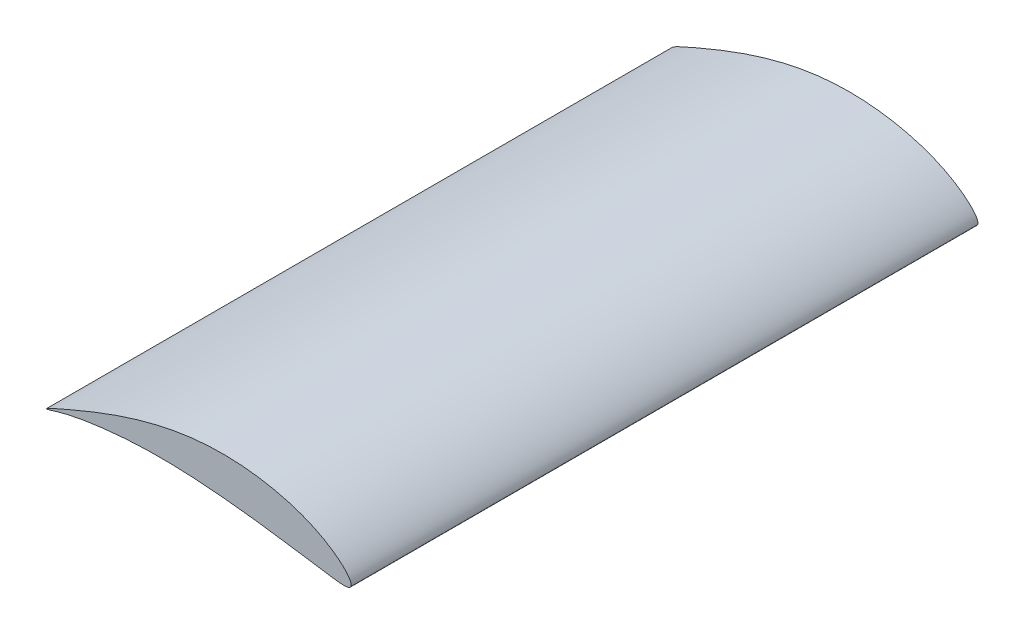
ISO-10303-21;
HEADER;
FILE_DESCRIPTION(('STEP AP214'),'2;1');
FILE_NAME('part.step','',(''),(''),'','','');
FILE_SCHEMA(('AUTOMOTIVE_DESIGN { 1 0 10303 214 1 1 1 1 }'));
ENDSEC;
DATA;
#1=APPLICATION_CONTEXT('core data for automotive mechanical design processes');
#2=APPLICATION_PROTOCOL_DEFINITION('international standard','automotive_design',2000,#1);
#3=PRODUCT_CONTEXT('',#1,'mechanical');
#4=PRODUCT('Part','Part','',(#3));
#5=PRODUCT_RELATED_PRODUCT_CATEGORY('part','',(#4));
#6=PRODUCT_DEFINITION_FORMATION('','',#4);
#7=PRODUCT_DEFINITION_CONTEXT('part definition',#1,'design');
#8=PRODUCT_DEFINITION('design','',#6,#7);
#9=PRODUCT_DEFINITION_SHAPE('','',#8);
#10=(LENGTH_UNIT() NAMED_UNIT(*) SI_UNIT(.MILLI.,.METRE.));
#11=(NAMED_UNIT(*) PLANE_ANGLE_UNIT() SI_UNIT($,.RADIAN.));
#12=(NAMED_UNIT(*) SI_UNIT($,.STERADIAN.) SOLID_ANGLE_UNIT());
#13=UNCERTAINTY_MEASURE_WITH_UNIT(LENGTH_MEASURE(1.E-05),#10,'distance_accuracy_value','');
#14=(GEOMETRIC_REPRESENTATION_CONTEXT(3) GLOBAL_UNCERTAINTY_ASSIGNED_CONTEXT((#13)) GLOBAL_UNIT_ASSIGNED_CONTEXT((#10,
#11,#12)) REPRESENTATION_CONTEXT('',''));
#15=CARTESIAN_POINT('',(0.,0.,0.));
#16=DIRECTION('',(0.,0.,1.));
#17=DIRECTION('',(1.,0.,0.));
#18=AXIS2_PLACEMENT_3D('',#15,#16,#17);
#19=CARTESIAN_POINT('',(-4.01569770567797,7.6413936640078,0.));
#20=DIRECTION('',(0.,0.,1.));
#21=DIRECTION('',(1.,0.,0.));
#22=AXIS2_PLACEMENT_3D('',#19,#20,#21);
#23=PLANE('',#22);
#24=CARTESIAN_POINT('',(-280.,0.014,0.));
#25=CARTESIAN_POINT('',(-279.771204707222,0.16829856286321,0.));
#26=CARTESIAN_POINT('',(-278.925281642335,0.738785444915881,0.));
#27=CARTESIAN_POINT('',(-277.112099035822,1.81145493001204,0.));
#28=CARTESIAN_POINT('',(-274.256791714638,3.26491157448409,0.));
#29=CARTESIAN_POINT('',(-270.467152625413,4.9472713282706,0.));
#30=CARTESIAN_POINT('',(-265.823521768113,7.00090594751356,0.));
#31=CARTESIAN_POINT('',(-260.30372490507,9.42028278027472,0.));
#32=CARTESIAN_POINT('',(-253.914026890152,12.132526753168,0.));
#33=CARTESIAN_POINT('',(-246.737129961845,15.1343419513262,0.));
#34=CARTESIAN_POINT('',(-238.843430318121,18.3591524786188,0.));
#35=CARTESIAN_POINT('',(-230.308105409819,21.7201635041301,0.));
#36=CARTESIAN_POINT('',(-221.209548368717,25.118644521127,0.));
#37=CARTESIAN_POINT('',(-211.633086788115,28.4758765124348,0.));
#38=CARTESIAN_POINT('',(-201.65733085926,31.7010514409087,0.));
#39=CARTESIAN_POINT('',(-191.372693180549,34.7397814525453,0.));
#40=CARTESIAN_POINT('',(-180.858920984524,37.5104983449512,0.));
#41=CARTESIAN_POINT('',(-170.196345420086,39.9452308087014,0.));
#42=CARTESIAN_POINT('',(-159.462988509903,41.9841439639911,0.));
#43=CARTESIAN_POINT('',(-148.709485722968,43.5780458592606,0.));
#44=CARTESIAN_POINT('',(-137.965500670848,44.7160423469702,0.));
#45=CARTESIAN_POINT('',(-127.257988986479,45.3688992655335,0.));
#46=CARTESIAN_POINT('',(-116.627978630922,45.5532963553043,0.));
#47=CARTESIAN_POINT('',(-106.135165372787,45.2525479001128,0.));
#48=CARTESIAN_POINT('',(-95.8312553124974,44.4969151433394,0.));
#49=CARTESIAN_POINT('',(-85.77263455369,43.3001663666237,0.));
#50=CARTESIAN_POINT('',(-76.0158477782512,41.6944021654237,0.));
#51=CARTESIAN_POINT('',(-66.6163245330872,39.711164621886,0.));
#52=CARTESIAN_POINT('',(-57.6315197591484,37.3706228779455,0.));
#53=CARTESIAN_POINT('',(-49.1130098143402,34.7105851682829,0.));
#54=CARTESIAN_POINT('',(-41.121037488414,31.7406709768156,0.));
#55=CARTESIAN_POINT('',(-33.7086167246629,28.5086261424112,0.));
#56=CARTESIAN_POINT('',(-26.9311950636037,25.0591382976576,0.));
#57=CARTESIAN_POINT('',(-20.8337324816237,21.4713810248683,0.));
#58=CARTESIAN_POINT('',(-15.4469769425425,17.85201901681,0.));
#59=CARTESIAN_POINT('',(-10.8005077639167,14.2855671608204,0.));
#60=CARTESIAN_POINT('',(-6.927579354582,10.8306846581378,0.));
#61=CARTESIAN_POINT('',(-3.84781649247876,7.56274984854721,0.));
#62=CARTESIAN_POINT('',(-1.6032425444141,4.57432221557344,0.));
#63=CARTESIAN_POINT('',(-0.316842726829754,2.08993164172271,0.));
#64=CARTESIAN_POINT('',(0.0955516083406207,0.147701002234351,0.));
#65=CARTESIAN_POINT('',(-0.190440036282485,-1.48008218093912,0.));
#66=CARTESIAN_POINT('',(-1.6181219099903,-2.81104592668113,0.));
#67=CARTESIAN_POINT('',(-3.98456270550732,-3.43021009401055,0.));
#68=CARTESIAN_POINT('',(-7.07396713922628,-3.62402271081694,0.));
#69=CARTESIAN_POINT('',(-10.9431991019674,-3.40377582967298,0.));
#70=CARTESIAN_POINT('',(-15.5713713547798,-2.86792500469395,0.));
#71=CARTESIAN_POINT('',(-20.9464422203592,-2.0962824107473,0.));
#72=CARTESIAN_POINT('',(-27.0380240353833,-1.18125327425882,0.));
#73=CARTESIAN_POINT('',(-33.8090901527232,-0.184623426700123,0.));
#74=CARTESIAN_POINT('',(-41.2077262986575,0.925009113586181,0.));
#75=CARTESIAN_POINT('',(-49.1870171143984,2.12163031281775,0.));
#76=CARTESIAN_POINT('',(-57.6897577132415,3.39105934404692,0.));
#77=CARTESIAN_POINT('',(-66.6635203954501,4.69526790087436,0.));
#78=CARTESIAN_POINT('',(-76.0515929731251,6.00864435022925,0.));
#79=CARTESIAN_POINT('',(-85.7985630976784,7.29838501496417,0.));
#80=CARTESIAN_POINT('',(-95.847404643839,8.53780484484674,0.));
#81=CARTESIAN_POINT('',(-106.140739911768,9.70566858617888,0.));
#82=CARTESIAN_POINT('',(-116.623055594311,10.7746415846232,0.));
#83=CARTESIAN_POINT('',(-127.242646452768,11.7253747610131,0.));
#84=CARTESIAN_POINT('',(-137.939971465741,12.5331503963465,0.));
#85=CARTESIAN_POINT('',(-148.67604442091,13.1728276796018,0.));
#86=CARTESIAN_POINT('',(-159.423043151761,13.6181343978469,0.));
#87=CARTESIAN_POINT('',(-170.153814535476,13.8510600518376,0.));
#88=CARTESIAN_POINT('',(-180.816971888348,13.8502166504001,0.));
#89=CARTESIAN_POINT('',(-191.33398763033,13.6110657668313,0.));
#90=CARTESIAN_POINT('',(-201.623483581562,13.1250966146957,0.));
#91=CARTESIAN_POINT('',(-211.601932997568,12.4309099898818,0.));
#92=CARTESIAN_POINT('',(-221.184797018405,11.5498191819582,0.));
#93=CARTESIAN_POINT('',(-230.291064502765,10.5253380054259,0.));
#94=CARTESIAN_POINT('',(-238.836766895428,9.36417282668983,0.));
#95=CARTESIAN_POINT('',(-246.740627761135,8.10017764530617,0.));
#96=CARTESIAN_POINT('',(-253.922603643824,6.76061862952087,0.));
#97=CARTESIAN_POINT('',(-260.310347725155,5.39867546775283,0.));
#98=CARTESIAN_POINT('',(-265.845478515148,4.05980298235575,0.));
#99=CARTESIAN_POINT('',(-270.478571586407,2.73074991744001,0.));
#100=CARTESIAN_POINT('',(-274.209001992196,1.52399427407298,0.));
#101=CARTESIAN_POINT('',(-277.055525725017,0.667762123567823,0.));
#102=CARTESIAN_POINT('',(-278.895533478517,0.20248248855209,0.));
#103=CARTESIAN_POINT('',(-279.77017857007,0.028829101559295,0.));
#104=CARTESIAN_POINT('',(-280.,-0.0168,0.));
#105=B_SPLINE_CURVE_WITH_KNOTS('',3,(#24,#25,#26,#27,#28,#29,#30,#31,#32,#33,#34,#35,#36,#37,
#38,#39,#40,#41,#42,#43,#44,#45,#46,#47,#48,#49,#50,#51,#52,#53,#54,#55,#56,#57,#58,#59,#60,#61,
#62,#63,#64,#65,#66,#67,#68,#69,#70,#71,#72,#73,#74,#75,#76,#77,#78,#79,#80,#81,#82,#83,#84,#85,
#86,#87,#88,#89,#90,#91,#92,#93,#94,#95,#96,#97,#98,#99,#100,#101,#102,#103,#104),.UNSPECIFIED.,
.F.,.F.,(4,1,1,1,1,1,1,1,1,1,1,1,1,1,1,1,1,1,1,1,1,1,1,1,1,1,1,1,1,1,1,1,1,1,1,1,1,1,1,1,1,1,1,
1,1,1,1,1,1,1,1,1,1,1,1,1,1,1,1,1,1,1,1,1,1,1,1,1,1,1,1,1,1,1,1,1,1,1,4),(0.,
0.00141347698915459,0.00522603753030976,0.0107810913857472,0.0178156081800761,0.026460950689211,
0.0367908885691698,0.0486855931526199,0.062017125033965,0.076639155258911,0.092362872446032,
0.109003461184226,0.12638690336568,0.144339125865098,0.162701027448999,0.181312718778214,
0.200023430663497,0.218712626381137,0.237261299204419,0.255692478420394,0.274037196641042,
0.292192582989639,0.310132767399931,0.327788162575705,0.345096618498639,0.36200193420608,
0.378421225753183,0.394286639421009,0.409543440211491,0.424114252666479,0.437937779894787,
0.450941832629922,0.463044023310106,0.474154416975767,0.484164574550778,0.493023961604412,
0.500713088022634,0.507125739322198,0.5121297054416,0.514904184931274,0.517171427264158,
0.520261618475645,0.524245300038304,0.529497960596986,0.536092184977371,0.544061140096641,
0.55336312730897,0.563904543129334,0.575614949415859,0.588420091890249,0.602226609671696,
0.616944447596993,0.632456508105352,0.648675826289431,0.66550111308048,0.682818193213687,
0.700538488106321,0.718564131538974,0.736789144730588,0.755151414762425,0.773513212407819,
0.791877575979801,0.81024492448745,0.828488568746422,0.846493195046706,0.864125178397901,
0.881248510345863,0.897725281664147,0.913415057961756,0.92818434584957,0.941897284560993,
0.954411455036345,0.965602701876979,0.975349727817201,0.983575521740871,0.99028457856453,
0.995432590285958,0.998799869064958,1.),.UNSPECIFIED.);
#106=CARTESIAN_POINT('',(-280.,0.014,0.));
#107=VERTEX_POINT('',#106);
#108=CARTESIAN_POINT('',(-280.,-0.0168,0.));
#109=VERTEX_POINT('',#108);
#110=EDGE_CURVE('E72',#107,#109,#105,.T.);
#111=ORIENTED_EDGE('',*,*,#110,.T.);
#112=DIRECTION('',(1.80231010491097E-12,-1.,0.));
#113=VECTOR('',#112,1.);
#114=CARTESIAN_POINT('',(-280.,0.014,0.));
#115=LINE('',#114,#113);
#116=EDGE_CURVE('E12',#107,#109,#115,.T.);
#117=ORIENTED_EDGE('',*,*,#116,.F.);
#118=EDGE_LOOP('',(#111,#117));
#119=FACE_BOUND('',#118,.T.);
#120=ADVANCED_FACE('F61',(#119),#23,.F.);
#121=CARTESIAN_POINT('',(-4.01569770567797,7.6413936640078,575.));
#122=DIRECTION('',(0.,0.,1.));
#123=DIRECTION('',(1.,0.,0.));
#124=AXIS2_PLACEMENT_3D('',#121,#122,#123);
#125=PLANE('',#124);
#126=CARTESIAN_POINT('',(-280.,-0.0168,575.));
#127=CARTESIAN_POINT('',(-279.77017857007,0.028829101559295,575.));
#128=CARTESIAN_POINT('',(-278.895533478517,0.20248248855209,575.));
#129=CARTESIAN_POINT('',(-277.055525725017,0.667762123567823,575.));
#130=CARTESIAN_POINT('',(-274.209001992196,1.52399427407298,575.));
#131=CARTESIAN_POINT('',(-270.478571586407,2.73074991744001,575.));
#132=CARTESIAN_POINT('',(-265.845478515148,4.05980298235575,575.));
#133=CARTESIAN_POINT('',(-260.310347725155,5.39867546775283,575.));
#134=CARTESIAN_POINT('',(-253.922603643824,6.76061862952087,575.));
#135=CARTESIAN_POINT('',(-246.740627761135,8.10017764530617,575.));
#136=CARTESIAN_POINT('',(-238.836766895428,9.36417282668983,575.));
#137=CARTESIAN_POINT('',(-230.291064502765,10.5253380054259,575.));
#138=CARTESIAN_POINT('',(-221.184797018405,11.5498191819582,575.));
#139=CARTESIAN_POINT('',(-211.601932997568,12.4309099898818,575.));
#140=CARTESIAN_POINT('',(-201.623483581562,13.1250966146957,575.));
#141=CARTESIAN_POINT('',(-191.33398763033,13.6110657668313,575.));
#142=CARTESIAN_POINT('',(-180.816971888348,13.8502166504001,575.));
#143=CARTESIAN_POINT('',(-170.153814535476,13.8510600518376,575.));
#144=CARTESIAN_POINT('',(-159.423043151761,13.6181343978469,575.));
#145=CARTESIAN_POINT('',(-148.67604442091,13.1728276796018,575.));
#146=CARTESIAN_POINT('',(-137.939971465741,12.5331503963465,575.));
#147=CARTESIAN_POINT('',(-127.242646452768,11.7253747610131,575.));
#148=CARTESIAN_POINT('',(-116.623055594311,10.7746415846232,575.));
#149=CARTESIAN_POINT('',(-106.140739911768,9.70566858617888,575.));
#150=CARTESIAN_POINT('',(-95.847404643839,8.53780484484674,575.));
#151=CARTESIAN_POINT('',(-85.7985630976784,7.29838501496417,575.));
#152=CARTESIAN_POINT('',(-76.0515929731251,6.00864435022925,575.));
#153=CARTESIAN_POINT('',(-66.6635203954501,4.69526790087436,575.));
#154=CARTESIAN_POINT('',(-57.6897577132415,3.39105934404692,575.));
#155=CARTESIAN_POINT('',(-49.1870171143984,2.12163031281775,575.));
#156=CARTESIAN_POINT('',(-41.2077262986575,0.925009113586181,575.));
#157=CARTESIAN_POINT('',(-33.8090901527232,-0.184623426700123,575.));
#158=CARTESIAN_POINT('',(-27.0380240353833,-1.18125327425882,575.));
#159=CARTESIAN_POINT('',(-20.9464422203592,-2.0962824107473,575.));
#160=CARTESIAN_POINT('',(-15.5713713547798,-2.86792500469395,575.));
#161=CARTESIAN_POINT('',(-10.9431991019674,-3.40377582967298,575.));
#162=CARTESIAN_POINT('',(-7.07396713922628,-3.62402271081694,575.));
#163=CARTESIAN_POINT('',(-3.98456270550732,-3.43021009401055,575.));
#164=CARTESIAN_POINT('',(-1.6181219099903,-2.81104592668113,575.));
#165=CARTESIAN_POINT('',(-0.190440036282485,-1.48008218093912,575.));
#166=CARTESIAN_POINT('',(0.0955516083406207,0.147701002234351,575.));
#167=CARTESIAN_POINT('',(-0.316842726829754,2.08993164172271,575.));
#168=CARTESIAN_POINT('',(-1.6032425444141,4.57432221557344,575.));
#169=CARTESIAN_POINT('',(-3.84781649247876,7.56274984854721,575.));
#170=CARTESIAN_POINT('',(-6.927579354582,10.8306846581378,575.));
#171=CARTESIAN_POINT('',(-10.8005077639167,14.2855671608204,575.));
#172=CARTESIAN_POINT('',(-15.4469769425425,17.85201901681,575.));
#173=CARTESIAN_POINT('',(-20.8337324816237,21.4713810248683,575.));
#174=CARTESIAN_POINT('',(-26.9311950636037,25.0591382976576,575.));
#175=CARTESIAN_POINT('',(-33.7086167246629,28.5086261424112,575.));
#176=CARTESIAN_POINT('',(-41.121037488414,31.7406709768156,575.));
#177=CARTESIAN_POINT('',(-49.1130098143402,34.7105851682829,575.));
#178=CARTESIAN_POINT('',(-57.6315197591484,37.3706228779455,575.));
#179=CARTESIAN_POINT('',(-66.6163245330872,39.711164621886,575.));
#180=CARTESIAN_POINT('',(-76.0158477782512,41.6944021654237,575.));
#181=CARTESIAN_POINT('',(-85.77263455369,43.3001663666237,575.));
#182=CARTESIAN_POINT('',(-95.8312553124974,44.4969151433394,575.));
#183=CARTESIAN_POINT('',(-106.135165372787,45.2525479001128,575.));
#184=CARTESIAN_POINT('',(-116.627978630922,45.5532963553043,575.));
#185=CARTESIAN_POINT('',(-127.257988986479,45.3688992655335,575.));
#186=CARTESIAN_POINT('',(-137.965500670848,44.7160423469702,575.));
#187=CARTESIAN_POINT('',(-148.709485722968,43.5780458592606,575.));
#188=CARTESIAN_POINT('',(-159.462988509903,41.9841439639911,575.));
#189=CARTESIAN_POINT('',(-170.196345420086,39.9452308087014,575.));
#190=CARTESIAN_POINT('',(-180.858920984524,37.5104983449512,575.));
#191=CARTESIAN_POINT('',(-191.372693180549,34.7397814525453,575.));
#192=CARTESIAN_POINT('',(-201.65733085926,31.7010514409087,575.));
#193=CARTESIAN_POINT('',(-211.633086788115,28.4758765124348,575.));
#194=CARTESIAN_POINT('',(-221.209548368717,25.118644521127,575.));
#195=CARTESIAN_POINT('',(-230.308105409819,21.7201635041301,575.));
#196=CARTESIAN_POINT('',(-238.843430318121,18.3591524786188,575.));
#197=CARTESIAN_POINT('',(-246.737129961845,15.1343419513262,575.));
#198=CARTESIAN_POINT('',(-253.914026890152,12.132526753168,575.));
#199=CARTESIAN_POINT('',(-260.30372490507,9.42028278027472,575.));
#200=CARTESIAN_POINT('',(-265.823521768113,7.00090594751356,575.));
#201=CARTESIAN_POINT('',(-270.467152625413,4.9472713282706,575.));
#202=CARTESIAN_POINT('',(-274.256791714638,3.26491157448409,575.));
#203=CARTESIAN_POINT('',(-277.112099035822,1.81145493001204,575.));
#204=CARTESIAN_POINT('',(-278.925281642335,0.738785444915881,575.));
#205=CARTESIAN_POINT('',(-279.771204707222,0.16829856286321,575.));
#206=CARTESIAN_POINT('',(-280.,0.014,575.));
#207=B_SPLINE_CURVE_WITH_KNOTS('',3,(#126,#127,#128,#129,#130,#131,#132,#133,#134,#135,#136,
#137,#138,#139,#140,#141,#142,#143,#144,#145,#146,#147,#148,#149,#150,#151,#152,#153,#154,#155,
#156,#157,#158,#159,#160,#161,#162,#163,#164,#165,#166,#167,#168,#169,#170,#171,#172,#173,#174,
#175,#176,#177,#178,#179,#180,#181,#182,#183,#184,#185,#186,#187,#188,#189,#190,#191,#192,#193,
#194,#195,#196,#197,#198,#199,#200,#201,#202,#203,#204,#205,#206),.UNSPECIFIED.,.F.,.F.,(4,1,1,
1,1,1,1,1,1,1,1,1,1,1,1,1,1,1,1,1,1,1,1,1,1,1,1,1,1,1,1,1,1,1,1,1,1,1,1,1,1,1,1,1,1,1,1,1,1,1,1,
1,1,1,1,1,1,1,1,1,1,1,1,1,1,1,1,1,1,1,1,1,1,1,1,1,1,1,4),(0.,0.00120013093504223,
0.00456740971404157,0.00971542143547044,0.0164244782591291,0.0246502721827989,
0.0343972981230208,0.0455885449636555,0.0581027154390068,0.0718156541504303,0.0865849420382439,
0.102274718335853,0.118751489654137,0.135874821602099,0.153506804953294,0.171511431253578,
0.18975507551255,0.208122424020199,0.226486787592181,0.244848585237575,0.263210855269412,
0.281435868461026,0.299461511893679,0.317181806786313,0.33449888691952,0.351324173710569,
0.367543491894648,0.383055552403007,0.397773390328304,0.411579908109751,0.424385050584141,
0.436095456870666,0.44663687269103,0.455938859903359,0.463907815022629,0.470502039403014,
0.475754699961696,0.479738381524355,0.482828572735842,0.485095815068726,0.4878702945584,
0.492874260677802,0.499286911977366,0.506976038395588,0.515835425449222,0.525845583024233,
0.536955976689894,0.549058167370078,0.562062220105213,0.575885747333521,0.590456559788509,
0.605713360578991,0.621578774246817,0.63799806579392,0.654903381501361,0.672211837424295,
0.689867232600069,0.707807417010361,0.725962803358958,0.744307521579606,0.762738700795581,
0.781287373618863,0.799976569336504,0.818687281221786,0.837298972551001,0.855660874134902,
0.87361309663432,0.890996538815774,0.907637127553968,0.923360844741089,0.937982874966035,
0.95131440684738,0.96320911143083,0.973539049310789,0.982184391819924,0.989218908614253,
0.99477396246969,0.998586523010845,1.),.UNSPECIFIED.);
#208=CARTESIAN_POINT('',(-280.,-0.0168,575.));
#209=VERTEX_POINT('',#208);
#210=CARTESIAN_POINT('',(-280.,0.014,575.));
#211=VERTEX_POINT('',#210);
#212=EDGE_CURVE('E96',#209,#211,#207,.T.);
#213=ORIENTED_EDGE('',*,*,#212,.T.);
#214=DIRECTION('',(0.,-1.,0.));
#215=VECTOR('',#214,1.);
#216=CARTESIAN_POINT('',(-280.,0.014,575.));
#217=LINE('',#216,#215);
#218=EDGE_CURVE('E101',#211,#209,#217,.T.);
#219=ORIENTED_EDGE('',*,*,#218,.T.);
#220=EDGE_LOOP('',(#213,#219));
#221=FACE_BOUND('',#220,.T.);
#222=ADVANCED_FACE('F111',(#221),#125,.T.);
#223=CARTESIAN_POINT('',(-280.,0.014,575.));
#224=CARTESIAN_POINT('',(-280.,0.014,0.));
#225=CARTESIAN_POINT('',(-279.771204707222,0.16829856286321,575.));
#226=CARTESIAN_POINT('',(-279.771204707222,0.16829856286321,0.));
#227=CARTESIAN_POINT('',(-278.925281642335,0.738785444915881,575.));
#228=CARTESIAN_POINT('',(-278.925281642335,0.738785444915881,0.));
#229=CARTESIAN_POINT('',(-277.112099035822,1.81145493001204,575.));
#230=CARTESIAN_POINT('',(-277.112099035822,1.81145493001204,0.));
#231=CARTESIAN_POINT('',(-274.256791714638,3.26491157448409,575.));
#232=CARTESIAN_POINT('',(-274.256791714638,3.26491157448409,0.));
#233=CARTESIAN_POINT('',(-270.467152625413,4.9472713282706,575.));
#234=CARTESIAN_POINT('',(-270.467152625413,4.9472713282706,0.));
#235=CARTESIAN_POINT('',(-265.823521768113,7.00090594751356,575.));
#236=CARTESIAN_POINT('',(-265.823521768113,7.00090594751356,0.));
#237=CARTESIAN_POINT('',(-260.30372490507,9.42028278027472,575.));
#238=CARTESIAN_POINT('',(-260.30372490507,9.42028278027472,0.));
#239=CARTESIAN_POINT('',(-253.914026890152,12.132526753168,575.));
#240=CARTESIAN_POINT('',(-253.914026890152,12.132526753168,0.));
#241=CARTESIAN_POINT('',(-246.737129961845,15.1343419513262,575.));
#242=CARTESIAN_POINT('',(-246.737129961845,15.1343419513262,0.));
#243=CARTESIAN_POINT('',(-238.843430318121,18.3591524786188,575.));
#244=CARTESIAN_POINT('',(-238.843430318121,18.3591524786188,0.));
#245=CARTESIAN_POINT('',(-230.308105409819,21.7201635041301,575.));
#246=CARTESIAN_POINT('',(-230.308105409819,21.7201635041301,0.));
#247=CARTESIAN_POINT('',(-221.209548368717,25.118644521127,575.));
#248=CARTESIAN_POINT('',(-221.209548368717,25.118644521127,0.));
#249=CARTESIAN_POINT('',(-211.633086788115,28.4758765124348,575.));
#250=CARTESIAN_POINT('',(-211.633086788115,28.4758765124348,0.));
#251=CARTESIAN_POINT('',(-201.65733085926,31.7010514409087,575.));
#252=CARTESIAN_POINT('',(-201.65733085926,31.7010514409087,0.));
#253=CARTESIAN_POINT('',(-191.372693180549,34.7397814525453,575.));
#254=CARTESIAN_POINT('',(-191.372693180549,34.7397814525453,0.));
#255=CARTESIAN_POINT('',(-180.858920984524,37.5104983449512,575.));
#256=CARTESIAN_POINT('',(-180.858920984524,37.5104983449512,0.));
#257=CARTESIAN_POINT('',(-170.196345420086,39.9452308087014,575.));
#258=CARTESIAN_POINT('',(-170.196345420086,39.9452308087014,0.));
#259=CARTESIAN_POINT('',(-159.462988509903,41.9841439639911,575.));
#260=CARTESIAN_POINT('',(-159.462988509903,41.9841439639911,0.));
#261=CARTESIAN_POINT('',(-148.709485722968,43.5780458592606,575.));
#262=CARTESIAN_POINT('',(-148.709485722968,43.5780458592606,0.));
#263=CARTESIAN_POINT('',(-137.965500670848,44.7160423469702,575.));
#264=CARTESIAN_POINT('',(-137.965500670848,44.7160423469702,0.));
#265=CARTESIAN_POINT('',(-127.257988986479,45.3688992655335,575.));
#266=CARTESIAN_POINT('',(-127.257988986479,45.3688992655335,0.));
#267=CARTESIAN_POINT('',(-116.627978630922,45.5532963553043,575.));
#268=CARTESIAN_POINT('',(-116.627978630922,45.5532963553043,0.));
#269=CARTESIAN_POINT('',(-106.135165372787,45.2525479001128,575.));
#270=CARTESIAN_POINT('',(-106.135165372787,45.2525479001128,0.));
#271=CARTESIAN_POINT('',(-95.8312553124974,44.4969151433394,575.));
#272=CARTESIAN_POINT('',(-95.8312553124974,44.4969151433394,0.));
#273=CARTESIAN_POINT('',(-85.77263455369,43.3001663666237,575.));
#274=CARTESIAN_POINT('',(-85.77263455369,43.3001663666237,0.));
#275=CARTESIAN_POINT('',(-76.0158477782512,41.6944021654237,575.));
#276=CARTESIAN_POINT('',(-76.0158477782512,41.6944021654237,0.));
#277=CARTESIAN_POINT('',(-66.6163245330872,39.711164621886,575.));
#278=CARTESIAN_POINT('',(-66.6163245330872,39.711164621886,0.));
#279=CARTESIAN_POINT('',(-57.6315197591484,37.3706228779455,575.));
#280=CARTESIAN_POINT('',(-57.6315197591484,37.3706228779455,0.));
#281=CARTESIAN_POINT('',(-49.1130098143402,34.7105851682829,575.));
#282=CARTESIAN_POINT('',(-49.1130098143402,34.7105851682829,0.));
#283=CARTESIAN_POINT('',(-41.121037488414,31.7406709768156,575.));
#284=CARTESIAN_POINT('',(-41.121037488414,31.7406709768156,0.));
#285=CARTESIAN_POINT('',(-33.7086167246629,28.5086261424112,575.));
#286=CARTESIAN_POINT('',(-33.7086167246629,28.5086261424112,0.));
#287=CARTESIAN_POINT('',(-26.9311950636037,25.0591382976576,575.));
#288=CARTESIAN_POINT('',(-26.9311950636037,25.0591382976576,0.));
#289=CARTESIAN_POINT('',(-20.8337324816237,21.4713810248683,575.));
#290=CARTESIAN_POINT('',(-20.8337324816237,21.4713810248683,0.));
#291=CARTESIAN_POINT('',(-15.4469769425425,17.85201901681,575.));
#292=CARTESIAN_POINT('',(-15.4469769425425,17.85201901681,0.));
#293=CARTESIAN_POINT('',(-10.8005077639167,14.2855671608204,575.));
#294=CARTESIAN_POINT('',(-10.8005077639167,14.2855671608204,0.));
#295=CARTESIAN_POINT('',(-6.927579354582,10.8306846581378,575.));
#296=CARTESIAN_POINT('',(-6.927579354582,10.8306846581378,0.));
#297=CARTESIAN_POINT('',(-3.84781649247876,7.56274984854721,575.));
#298=CARTESIAN_POINT('',(-3.84781649247876,7.56274984854721,0.));
#299=CARTESIAN_POINT('',(-1.6032425444141,4.57432221557344,575.));
#300=CARTESIAN_POINT('',(-1.6032425444141,4.57432221557344,0.));
#301=CARTESIAN_POINT('',(-0.316842726829754,2.08993164172271,575.));
#302=CARTESIAN_POINT('',(-0.316842726829754,2.08993164172271,0.));
#303=CARTESIAN_POINT('',(0.0955516083406207,0.147701002234351,575.));
#304=CARTESIAN_POINT('',(0.0955516083406207,0.147701002234351,0.));
#305=CARTESIAN_POINT('',(-0.190440036282485,-1.48008218093912,575.));
#306=CARTESIAN_POINT('',(-0.190440036282485,-1.48008218093912,0.));
#307=CARTESIAN_POINT('',(-1.6181219099903,-2.81104592668113,575.));
#308=CARTESIAN_POINT('',(-1.6181219099903,-2.81104592668113,0.));
#309=CARTESIAN_POINT('',(-3.98456270550732,-3.43021009401055,575.));
#310=CARTESIAN_POINT('',(-3.98456270550732,-3.43021009401055,0.));
#311=CARTESIAN_POINT('',(-7.07396713922628,-3.62402271081694,575.));
#312=CARTESIAN_POINT('',(-7.07396713922628,-3.62402271081694,0.));
#313=CARTESIAN_POINT('',(-10.9431991019674,-3.40377582967298,575.));
#314=CARTESIAN_POINT('',(-10.9431991019674,-3.40377582967298,0.));
#315=CARTESIAN_POINT('',(-15.5713713547798,-2.86792500469395,575.));
#316=CARTESIAN_POINT('',(-15.5713713547798,-2.86792500469395,0.));
#317=CARTESIAN_POINT('',(-20.9464422203592,-2.0962824107473,575.));
#318=CARTESIAN_POINT('',(-20.9464422203592,-2.0962824107473,0.));
#319=CARTESIAN_POINT('',(-27.0380240353833,-1.18125327425882,575.));
#320=CARTESIAN_POINT('',(-27.0380240353833,-1.18125327425882,0.));
#321=CARTESIAN_POINT('',(-33.8090901527232,-0.184623426700123,575.));
#322=CARTESIAN_POINT('',(-33.8090901527232,-0.184623426700123,0.));
#323=CARTESIAN_POINT('',(-41.2077262986575,0.925009113586181,575.));
#324=CARTESIAN_POINT('',(-41.2077262986575,0.925009113586181,0.));
#325=CARTESIAN_POINT('',(-49.1870171143984,2.12163031281775,575.));
#326=CARTESIAN_POINT('',(-49.1870171143984,2.12163031281775,0.));
#327=CARTESIAN_POINT('',(-57.6897577132415,3.39105934404692,575.));
#328=CARTESIAN_POINT('',(-57.6897577132415,3.39105934404692,0.));
#329=CARTESIAN_POINT('',(-66.6635203954501,4.69526790087436,575.));
#330=CARTESIAN_POINT('',(-66.6635203954501,4.69526790087436,0.));
#331=CARTESIAN_POINT('',(-76.0515929731251,6.00864435022925,575.));
#332=CARTESIAN_POINT('',(-76.0515929731251,6.00864435022925,0.));
#333=CARTESIAN_POINT('',(-85.7985630976784,7.29838501496417,575.));
#334=CARTESIAN_POINT('',(-85.7985630976784,7.29838501496417,0.));
#335=CARTESIAN_POINT('',(-95.847404643839,8.53780484484674,575.));
#336=CARTESIAN_POINT('',(-95.847404643839,8.53780484484674,0.));
#337=CARTESIAN_POINT('',(-106.140739911768,9.70566858617888,575.));
#338=CARTESIAN_POINT('',(-106.140739911768,9.70566858617888,0.));
#339=CARTESIAN_POINT('',(-116.623055594311,10.7746415846232,575.));
#340=CARTESIAN_POINT('',(-116.623055594311,10.7746415846232,0.));
#341=CARTESIAN_POINT('',(-127.242646452768,11.7253747610131,575.));
#342=CARTESIAN_POINT('',(-127.242646452768,11.7253747610131,0.));
#343=CARTESIAN_POINT('',(-137.939971465741,12.5331503963465,575.));
#344=CARTESIAN_POINT('',(-137.939971465741,12.5331503963465,0.));
#345=CARTESIAN_POINT('',(-148.67604442091,13.1728276796018,575.));
#346=CARTESIAN_POINT('',(-148.67604442091,13.1728276796018,0.));
#347=CARTESIAN_POINT('',(-159.423043151761,13.6181343978469,575.));
#348=CARTESIAN_POINT('',(-159.423043151761,13.6181343978469,0.));
#349=CARTESIAN_POINT('',(-170.153814535476,13.8510600518376,575.));
#350=CARTESIAN_POINT('',(-170.153814535476,13.8510600518376,0.));
#351=CARTESIAN_POINT('',(-180.816971888348,13.8502166504001,575.));
#352=CARTESIAN_POINT('',(-180.816971888348,13.8502166504001,0.));
#353=CARTESIAN_POINT('',(-191.33398763033,13.6110657668313,575.));
#354=CARTESIAN_POINT('',(-191.33398763033,13.6110657668313,0.));
#355=CARTESIAN_POINT('',(-201.623483581562,13.1250966146957,575.));
#356=CARTESIAN_POINT('',(-201.623483581562,13.1250966146957,0.));
#357=CARTESIAN_POINT('',(-211.601932997568,12.4309099898818,575.));
#358=CARTESIAN_POINT('',(-211.601932997568,12.4309099898818,0.));
#359=CARTESIAN_POINT('',(-221.184797018405,11.5498191819582,575.));
#360=CARTESIAN_POINT('',(-221.184797018405,11.5498191819582,0.));
#361=CARTESIAN_POINT('',(-230.291064502765,10.5253380054259,575.));
#362=CARTESIAN_POINT('',(-230.291064502765,10.5253380054259,0.));
#363=CARTESIAN_POINT('',(-238.836766895428,9.36417282668983,575.));
#364=CARTESIAN_POINT('',(-238.836766895428,9.36417282668983,0.));
#365=CARTESIAN_POINT('',(-246.740627761135,8.10017764530617,575.));
#366=CARTESIAN_POINT('',(-246.740627761135,8.10017764530617,0.));
#367=CARTESIAN_POINT('',(-253.922603643824,6.76061862952087,575.));
#368=CARTESIAN_POINT('',(-253.922603643824,6.76061862952087,0.));
#369=CARTESIAN_POINT('',(-260.310347725155,5.39867546775283,575.));
#370=CARTESIAN_POINT('',(-260.310347725155,5.39867546775283,0.));
#371=CARTESIAN_POINT('',(-265.845478515148,4.05980298235575,575.));
#372=CARTESIAN_POINT('',(-265.845478515148,4.05980298235575,0.));
#373=CARTESIAN_POINT('',(-270.478571586407,2.73074991744001,575.));
#374=CARTESIAN_POINT('',(-270.478571586407,2.73074991744001,0.));
#375=CARTESIAN_POINT('',(-274.209001992196,1.52399427407298,575.));
#376=CARTESIAN_POINT('',(-274.209001992196,1.52399427407298,0.));
#377=CARTESIAN_POINT('',(-277.055525725017,0.667762123567823,575.));
#378=CARTESIAN_POINT('',(-277.055525725017,0.667762123567823,0.));
#379=CARTESIAN_POINT('',(-278.895533478517,0.20248248855209,575.));
#380=CARTESIAN_POINT('',(-278.895533478517,0.20248248855209,0.));
#381=CARTESIAN_POINT('',(-279.77017857007,0.028829101559295,575.));
#382=CARTESIAN_POINT('',(-279.77017857007,0.028829101559295,0.));
#383=CARTESIAN_POINT('',(-280.,-0.0168,575.));
#384=CARTESIAN_POINT('',(-280.,-0.0168,0.));
#385=B_SPLINE_SURFACE_WITH_KNOTS('',3,1,((#223,#224),(#225,#226),(#227,#228),(#229,#230),(#231,
#232),(#233,#234),(#235,#236),(#237,#238),(#239,#240),(#241,#242),(#243,#244),(#245,#246),(#247,
#248),(#249,#250),(#251,#252),(#253,#254),(#255,#256),(#257,#258),(#259,#260),(#261,#262),(#263,
#264),(#265,#266),(#267,#268),(#269,#270),(#271,#272),(#273,#274),(#275,#276),(#277,#278),(#279,
#280),(#281,#282),(#283,#284),(#285,#286),(#287,#288),(#289,#290),(#291,#292),(#293,#294),(#295,
#296),(#297,#298),(#299,#300),(#301,#302),(#303,#304),(#305,#306),(#307,#308),(#309,#310),(#311,
#312),(#313,#314),(#315,#316),(#317,#318),(#319,#320),(#321,#322),(#323,#324),(#325,#326),(#327,
#328),(#329,#330),(#331,#332),(#333,#334),(#335,#336),(#337,#338),(#339,#340),(#341,#342),(#343,
#344),(#345,#346),(#347,#348),(#349,#350),(#351,#352),(#353,#354),(#355,#356),(#357,#358),(#359,
#360),(#361,#362),(#363,#364),(#365,#366),(#367,#368),(#369,#370),(#371,#372),(#373,#374),(#375,
#376),(#377,#378),(#379,#380),(#381,#382),(#383,#384)),.UNSPECIFIED.,.F.,.F.,.F.,(4,1,1,1,1,1,1,
1,1,1,1,1,1,1,1,1,1,1,1,1,1,1,1,1,1,1,1,1,1,1,1,1,1,1,1,1,1,1,1,1,1,1,1,1,1,1,1,1,1,1,1,1,1,1,1,
1,1,1,1,1,1,1,1,1,1,1,1,1,1,1,1,1,1,1,1,1,1,1,4),(2,2),(0.,0.00141347698915459,
0.0052260375303097,0.0107810913857472,0.0178156081800761,0.0264609506892111,0.0367908885691698,
0.0486855931526199,0.0620171250339651,0.076639155258911,0.0923628724460319,0.109003461184226,
0.12638690336568,0.144339125865098,0.162701027448999,0.181312718778214,0.200023430663496,
0.218712626381137,0.237261299204419,0.255692478420394,0.274037196641042,0.292192582989639,
0.310132767399931,0.327788162575705,0.345096618498639,0.36200193420608,0.378421225753183,
0.394286639421009,0.409543440211491,0.424114252666479,0.437937779894787,0.450941832629922,
0.463044023310106,0.474154416975767,0.484164574550778,0.493023961604412,0.500713088022634,
0.507125739322198,0.5121297054416,0.514904184931274,0.517171427264158,0.520261618475645,
0.524245300038304,0.529497960596986,0.536092184977371,0.544061140096641,0.55336312730897,
0.563904543129334,0.575614949415859,0.588420091890249,0.602226609671696,0.616944447596993,
0.632456508105352,0.648675826289431,0.66550111308048,0.682818193213687,0.700538488106321,
0.718564131538974,0.736789144730588,0.755151414762425,0.773513212407819,0.791877575979801,
0.81024492448745,0.828488568746422,0.846493195046706,0.864125178397901,0.881248510345863,
0.897725281664147,0.913415057961756,0.92818434584957,0.941897284560993,0.954411455036345,
0.965602701876979,0.975349727817201,0.983575521740871,0.99028457856453,0.995432590285958,
0.998799869064958,1.),(0.,1.),.UNSPECIFIED.);
#386=DIRECTION('',(0.,0.,-1.));
#387=VECTOR('',#386,1.);
#388=CARTESIAN_POINT('',(-280.,-0.0168,287.5));
#389=LINE('',#388,#387);
#390=EDGE_CURVE('E80',#209,#109,#389,.T.);
#391=DIRECTION('',(0.,0.,1.));
#392=VECTOR('',#391,1.);
#393=CARTESIAN_POINT('',(-280.,0.014,287.5));
#394=LINE('',#393,#392);
#395=EDGE_CURVE('E92',#107,#211,#394,.T.);
#396=ORIENTED_EDGE('',*,*,#212,.F.);
#397=ORIENTED_EDGE('',*,*,#390,.T.);
#398=ORIENTED_EDGE('',*,*,#110,.F.);
#399=ORIENTED_EDGE('',*,*,#395,.T.);
#400=EDGE_LOOP('',(#396,#397,#398,#399));
#401=FACE_BOUND('',#400,.T.);
#402=ADVANCED_FACE('F94',(#401),#385,.T.);
#403=CARTESIAN_POINT('',(-280.,-5.04646829375071E-10,0.));
#404=DIRECTION('',(-1.,-1.80231010491097E-12,0.));
#405=DIRECTION('',(1.80231010491097E-12,-1.,0.));
#406=AXIS2_PLACEMENT_3D('',#403,#404,#405);
#407=PLANE('',#406);
#408=ORIENTED_EDGE('',*,*,#395,.F.);
#409=ORIENTED_EDGE('',*,*,#116,.T.);
#410=ORIENTED_EDGE('',*,*,#390,.F.);
#411=ORIENTED_EDGE('',*,*,#218,.F.);
#412=EDGE_LOOP('',(#408,#409,#410,#411));
#413=FACE_BOUND('',#412,.T.);
#414=ADVANCED_FACE('F104',(#413),#407,.T.);
#415=CLOSED_SHELL('',(#120,#222,#402,#414));
#416=MANIFOLD_SOLID_BREP('B2',#415);
#417=ADVANCED_BREP_SHAPE_REPRESENTATION('',(#18,#416),#14);
#418=SHAPE_DEFINITION_REPRESENTATION(#9,#417);
ENDSEC;
END-ISO-10303-21;
